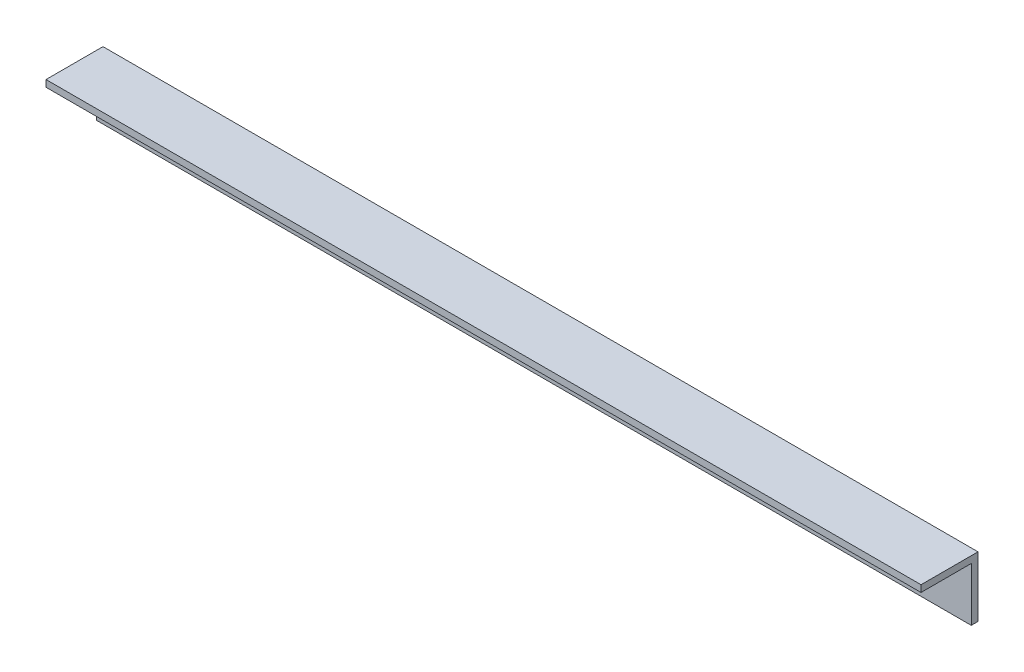
ISO-10303-21;
HEADER;
FILE_DESCRIPTION(('STEP AP214'),'2;1');
FILE_NAME('part.step','',(''),(''),'','','');
FILE_SCHEMA(('AUTOMOTIVE_DESIGN { 1 0 10303 214 1 1 1 1 }'));
ENDSEC;
DATA;
#1=APPLICATION_CONTEXT('core data for automotive mechanical design processes');
#2=APPLICATION_PROTOCOL_DEFINITION('international standard','automotive_design',2000,#1);
#3=PRODUCT_CONTEXT('',#1,'mechanical');
#4=PRODUCT('Part','Part','',(#3));
#5=PRODUCT_RELATED_PRODUCT_CATEGORY('part','',(#4));
#6=PRODUCT_DEFINITION_FORMATION('','',#4);
#7=PRODUCT_DEFINITION_CONTEXT('part definition',#1,'design');
#8=PRODUCT_DEFINITION('design','',#6,#7);
#9=PRODUCT_DEFINITION_SHAPE('','',#8);
#10=(LENGTH_UNIT() NAMED_UNIT(*) SI_UNIT(.MILLI.,.METRE.));
#11=(NAMED_UNIT(*) PLANE_ANGLE_UNIT() SI_UNIT($,.RADIAN.));
#12=(NAMED_UNIT(*) SI_UNIT($,.STERADIAN.) SOLID_ANGLE_UNIT());
#13=UNCERTAINTY_MEASURE_WITH_UNIT(LENGTH_MEASURE(1.E-05),#10,'distance_accuracy_value','');
#14=(GEOMETRIC_REPRESENTATION_CONTEXT(3) GLOBAL_UNCERTAINTY_ASSIGNED_CONTEXT((#13)) GLOBAL_UNIT_ASSIGNED_CONTEXT((#10,
#11,#12)) REPRESENTATION_CONTEXT('',''));
#15=CARTESIAN_POINT('',(0.,0.,0.));
#16=DIRECTION('',(0.,0.,1.));
#17=DIRECTION('',(1.,0.,0.));
#18=AXIS2_PLACEMENT_3D('',#15,#16,#17);
#19=CARTESIAN_POINT('',(-195.,25.4,3.));
#20=DIRECTION('',(1.,0.,0.));
#21=DIRECTION('',(0.,0.,-1.));
#22=AXIS2_PLACEMENT_3D('',#19,#20,#21);
#23=PLANE('',#22);
#24=DIRECTION('',(0.,0.,-1.));
#25=VECTOR('',#24,1.);
#26=CARTESIAN_POINT('',(-195.,-1.5,50.8));
#27=LINE('',#26,#25);
#28=CARTESIAN_POINT('',(-195.,-1.5,25.4));
#29=VERTEX_POINT('',#28);
#30=CARTESIAN_POINT('',(-195.,-1.5,3.));
#31=VERTEX_POINT('',#30);
#32=EDGE_CURVE('E34',#29,#31,#27,.T.);
#33=ORIENTED_EDGE('',*,*,#32,.F.);
#34=DIRECTION('',(0.,1.,0.));
#35=VECTOR('',#34,1.);
#36=CARTESIAN_POINT('',(-195.,-25.401025,25.4));
#37=LINE('',#36,#35);
#38=CARTESIAN_POINT('',(-195.,1.5,25.4));
#39=VERTEX_POINT('',#38);
#40=EDGE_CURVE('E87',#29,#39,#37,.T.);
#41=ORIENTED_EDGE('',*,*,#40,.T.);
#42=DIRECTION('',(0.,0.,-1.));
#43=VECTOR('',#42,1.);
#44=CARTESIAN_POINT('',(-195.,1.5,50.8));
#45=LINE('',#44,#43);
#46=CARTESIAN_POINT('',(-195.,1.5,0.));
#47=VERTEX_POINT('',#46);
#48=EDGE_CURVE('E104',#39,#47,#45,.T.);
#49=ORIENTED_EDGE('',*,*,#48,.T.);
#50=DIRECTION('',(0.,-1.,0.));
#51=VECTOR('',#50,1.);
#52=CARTESIAN_POINT('',(-195.,25.4,0.));
#53=LINE('',#52,#51);
#54=CARTESIAN_POINT('',(-195.,-25.4,0.));
#55=VERTEX_POINT('',#54);
#56=EDGE_CURVE('E103',#47,#55,#53,.T.);
#57=ORIENTED_EDGE('',*,*,#56,.T.);
#58=DIRECTION('',(0.,0.,-1.));
#59=VECTOR('',#58,1.);
#60=CARTESIAN_POINT('',(-195.,-25.4,3.));
#61=LINE('',#60,#59);
#62=CARTESIAN_POINT('',(-195.,-25.4,3.));
#63=VERTEX_POINT('',#62);
#64=EDGE_CURVE('E11',#63,#55,#61,.T.);
#65=ORIENTED_EDGE('',*,*,#64,.F.);
#66=DIRECTION('',(0.,-1.,0.));
#67=VECTOR('',#66,1.);
#68=CARTESIAN_POINT('',(-195.,25.4,3.));
#69=LINE('',#68,#67);
#70=EDGE_CURVE('E126',#31,#63,#69,.T.);
#71=ORIENTED_EDGE('',*,*,#70,.F.);
#72=EDGE_LOOP('',(#33,#41,#49,#57,#65,#71));
#73=FACE_BOUND('',#72,.T.);
#74=ADVANCED_FACE('F31',(#73),#23,.F.);
#75=CARTESIAN_POINT('',(-195.,-25.4,3.));
#76=DIRECTION('',(0.,1.,0.));
#77=DIRECTION('',(0.,0.,1.));
#78=AXIS2_PLACEMENT_3D('',#75,#76,#77);
#79=PLANE('',#78);
#80=DIRECTION('',(1.,0.,0.));
#81=VECTOR('',#80,1.);
#82=CARTESIAN_POINT('',(-195.,-25.4,0.));
#83=LINE('',#82,#81);
#84=CARTESIAN_POINT('',(195.,-25.4,0.));
#85=VERTEX_POINT('',#84);
#86=EDGE_CURVE('E132',#55,#85,#83,.T.);
#87=ORIENTED_EDGE('',*,*,#86,.T.);
#88=DIRECTION('',(0.,0.,-1.));
#89=VECTOR('',#88,1.);
#90=CARTESIAN_POINT('',(195.,-25.4,3.));
#91=LINE('',#90,#89);
#92=CARTESIAN_POINT('',(195.,-25.4,3.));
#93=VERTEX_POINT('',#92);
#94=EDGE_CURVE('E40',#93,#85,#91,.T.);
#95=ORIENTED_EDGE('',*,*,#94,.F.);
#96=DIRECTION('',(1.,0.,0.));
#97=VECTOR('',#96,1.);
#98=CARTESIAN_POINT('',(-195.,-25.4,3.));
#99=LINE('',#98,#97);
#100=EDGE_CURVE('E125',#63,#93,#99,.T.);
#101=ORIENTED_EDGE('',*,*,#100,.F.);
#102=ORIENTED_EDGE('',*,*,#64,.T.);
#103=EDGE_LOOP('',(#87,#95,#101,#102));
#104=FACE_BOUND('',#103,.T.);
#105=ADVANCED_FACE('F149',(#104),#79,.F.);
#106=CARTESIAN_POINT('',(195.,25.4,3.));
#107=DIRECTION('',(-1.,0.,0.));
#108=DIRECTION('',(0.,0.,1.));
#109=AXIS2_PLACEMENT_3D('',#106,#107,#108);
#110=PLANE('',#109);
#111=DIRECTION('',(0.,0.,-1.));
#112=VECTOR('',#111,1.);
#113=CARTESIAN_POINT('',(195.,1.5,50.8));
#114=LINE('',#113,#112);
#115=CARTESIAN_POINT('',(195.,1.5,25.4));
#116=VERTEX_POINT('',#115);
#117=CARTESIAN_POINT('',(195.,1.5,0.));
#118=VERTEX_POINT('',#117);
#119=EDGE_CURVE('E98',#116,#118,#114,.T.);
#120=ORIENTED_EDGE('',*,*,#119,.F.);
#121=DIRECTION('',(0.,1.,0.));
#122=VECTOR('',#121,1.);
#123=CARTESIAN_POINT('',(195.,-25.401025,25.4));
#124=LINE('',#123,#122);
#125=CARTESIAN_POINT('',(195.,-1.5,25.4));
#126=VERTEX_POINT('',#125);
#127=EDGE_CURVE('E48',#126,#116,#124,.T.);
#128=ORIENTED_EDGE('',*,*,#127,.F.);
#129=DIRECTION('',(0.,0.,-1.));
#130=VECTOR('',#129,1.);
#131=CARTESIAN_POINT('',(195.,-1.5,50.8));
#132=LINE('',#131,#130);
#133=CARTESIAN_POINT('',(195.,-1.5,3.));
#134=VERTEX_POINT('',#133);
#135=EDGE_CURVE('E95',#126,#134,#132,.T.);
#136=ORIENTED_EDGE('',*,*,#135,.T.);
#137=DIRECTION('',(0.,1.,0.));
#138=VECTOR('',#137,1.);
#139=CARTESIAN_POINT('',(195.,25.4,3.));
#140=LINE('',#139,#138);
#141=EDGE_CURVE('E117',#93,#134,#140,.T.);
#142=ORIENTED_EDGE('',*,*,#141,.F.);
#143=ORIENTED_EDGE('',*,*,#94,.T.);
#144=DIRECTION('',(0.,1.,0.));
#145=VECTOR('',#144,1.);
#146=CARTESIAN_POINT('',(195.,25.4,0.));
#147=LINE('',#146,#145);
#148=EDGE_CURVE('E127',#85,#118,#147,.T.);
#149=ORIENTED_EDGE('',*,*,#148,.T.);
#150=EDGE_LOOP('',(#120,#128,#136,#142,#143,#149));
#151=FACE_BOUND('',#150,.T.);
#152=ADVANCED_FACE('F93',(#151),#110,.F.);
#153=CARTESIAN_POINT('',(-195.,-25.4,3.));
#154=DIRECTION('',(0.,0.,1.));
#155=DIRECTION('',(1.,0.,0.));
#156=AXIS2_PLACEMENT_3D('',#153,#154,#155);
#157=PLANE('',#156);
#158=DIRECTION('',(1.,0.,0.));
#159=VECTOR('',#158,1.);
#160=CARTESIAN_POINT('',(-195.,-1.5,3.));
#161=LINE('',#160,#159);
#162=EDGE_CURVE('E102',#31,#134,#161,.T.);
#163=ORIENTED_EDGE('',*,*,#162,.F.);
#164=ORIENTED_EDGE('',*,*,#70,.T.);
#165=ORIENTED_EDGE('',*,*,#100,.T.);
#166=ORIENTED_EDGE('',*,*,#141,.T.);
#167=EDGE_LOOP('',(#163,#164,#165,#166));
#168=FACE_BOUND('',#167,.T.);
#169=ADVANCED_FACE('F151',(#168),#157,.T.);
#170=CARTESIAN_POINT('',(-195.,-25.4,0.));
#171=DIRECTION('',(0.,0.,1.));
#172=DIRECTION('',(1.,0.,0.));
#173=AXIS2_PLACEMENT_3D('',#170,#171,#172);
#174=PLANE('',#173);
#175=ORIENTED_EDGE('',*,*,#56,.F.);
#176=DIRECTION('',(-1.,0.,0.));
#177=VECTOR('',#176,1.);
#178=CARTESIAN_POINT('',(219.087548650703,1.5,0.));
#179=LINE('',#178,#177);
#180=EDGE_CURVE('E89',#118,#47,#179,.T.);
#181=ORIENTED_EDGE('',*,*,#180,.F.);
#182=ORIENTED_EDGE('',*,*,#148,.F.);
#183=ORIENTED_EDGE('',*,*,#86,.F.);
#184=EDGE_LOOP('',(#175,#181,#182,#183));
#185=FACE_BOUND('',#184,.T.);
#186=ADVANCED_FACE('F145',(#185),#174,.F.);
#187=CARTESIAN_POINT('',(-195.,-1.5,50.8));
#188=DIRECTION('',(0.,1.,0.));
#189=DIRECTION('',(0.,0.,1.));
#190=AXIS2_PLACEMENT_3D('',#187,#188,#189);
#191=PLANE('',#190);
#192=ORIENTED_EDGE('',*,*,#135,.F.);
#193=DIRECTION('',(1.,0.,0.));
#194=VECTOR('',#193,1.);
#195=CARTESIAN_POINT('',(195.,-1.5,25.4));
#196=LINE('',#195,#194);
#197=EDGE_CURVE('E84',#29,#126,#196,.T.);
#198=ORIENTED_EDGE('',*,*,#197,.F.);
#199=ORIENTED_EDGE('',*,*,#32,.T.);
#200=ORIENTED_EDGE('',*,*,#162,.T.);
#201=EDGE_LOOP('',(#192,#198,#199,#200));
#202=FACE_BOUND('',#201,.T.);
#203=ADVANCED_FACE('F101',(#202),#191,.F.);
#204=CARTESIAN_POINT('',(-195.,1.5,50.8));
#205=DIRECTION('',(0.,-1.,0.));
#206=DIRECTION('',(0.,0.,-1.));
#207=AXIS2_PLACEMENT_3D('',#204,#205,#206);
#208=PLANE('',#207);
#209=ORIENTED_EDGE('',*,*,#48,.F.);
#210=DIRECTION('',(-1.,0.,0.));
#211=VECTOR('',#210,1.);
#212=CARTESIAN_POINT('',(195.,1.5,25.4));
#213=LINE('',#212,#211);
#214=EDGE_CURVE('E99',#116,#39,#213,.T.);
#215=ORIENTED_EDGE('',*,*,#214,.F.);
#216=ORIENTED_EDGE('',*,*,#119,.T.);
#217=ORIENTED_EDGE('',*,*,#180,.T.);
#218=EDGE_LOOP('',(#209,#215,#216,#217));
#219=FACE_BOUND('',#218,.T.);
#220=ADVANCED_FACE('F154',(#219),#208,.F.);
#221=CARTESIAN_POINT('',(195.,-25.401025,25.4));
#222=DIRECTION('',(0.,0.,-1.));
#223=DIRECTION('',(-1.,0.,0.));
#224=AXIS2_PLACEMENT_3D('',#221,#222,#223);
#225=PLANE('',#224);
#226=ORIENTED_EDGE('',*,*,#197,.T.);
#227=ORIENTED_EDGE('',*,*,#127,.T.);
#228=ORIENTED_EDGE('',*,*,#214,.T.);
#229=ORIENTED_EDGE('',*,*,#40,.F.);
#230=EDGE_LOOP('',(#226,#227,#228,#229));
#231=FACE_BOUND('',#230,.T.);
#232=ADVANCED_FACE('F85',(#231),#225,.F.);
#233=CLOSED_SHELL('',(#74,#105,#152,#169,#186,#203,#220,#232));
#234=MANIFOLD_SOLID_BREP('B2',#233);
#235=ADVANCED_BREP_SHAPE_REPRESENTATION('',(#18,#234),#14);
#236=SHAPE_DEFINITION_REPRESENTATION(#9,#235);
ENDSEC;
END-ISO-10303-21;
